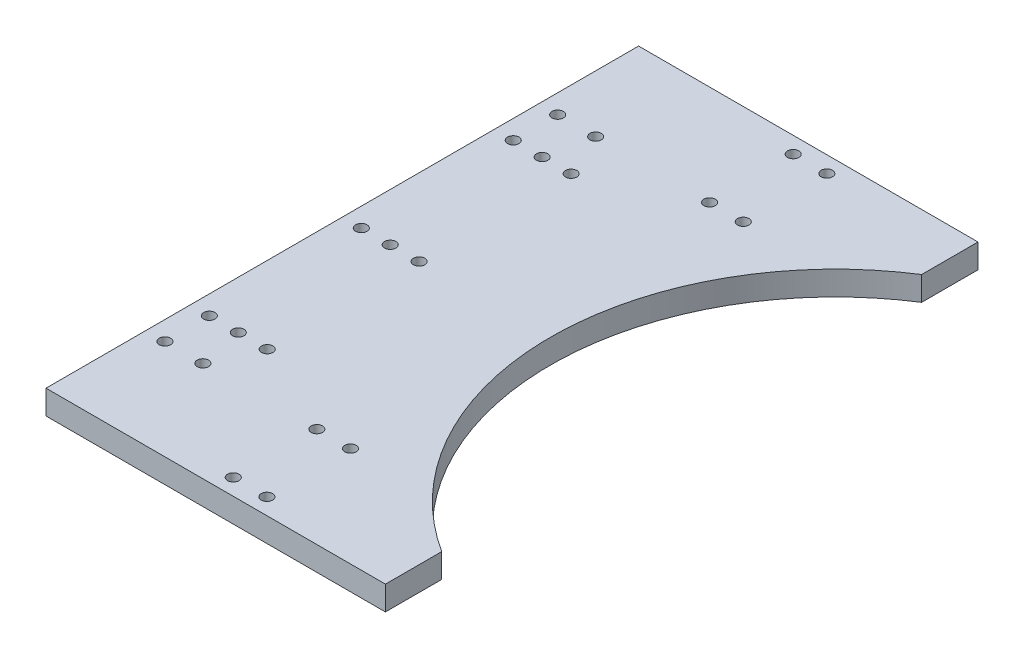
ISO-10303-21;
HEADER;
FILE_DESCRIPTION(('STEP AP214'),'2;1');
FILE_NAME('part.step','',(''),(''),'','','');
FILE_SCHEMA(('AUTOMOTIVE_DESIGN { 1 0 10303 214 1 1 1 1 }'));
ENDSEC;
DATA;
#1=APPLICATION_CONTEXT('core data for automotive mechanical design processes');
#2=APPLICATION_PROTOCOL_DEFINITION('international standard','automotive_design',2000,#1);
#3=PRODUCT_CONTEXT('',#1,'mechanical');
#4=PRODUCT('Part','Part','',(#3));
#5=PRODUCT_RELATED_PRODUCT_CATEGORY('part','',(#4));
#6=PRODUCT_DEFINITION_FORMATION('','',#4);
#7=PRODUCT_DEFINITION_CONTEXT('part definition',#1,'design');
#8=PRODUCT_DEFINITION('design','',#6,#7);
#9=PRODUCT_DEFINITION_SHAPE('','',#8);
#10=(LENGTH_UNIT() NAMED_UNIT(*) SI_UNIT(.MILLI.,.METRE.));
#11=(NAMED_UNIT(*) PLANE_ANGLE_UNIT() SI_UNIT($,.RADIAN.));
#12=(NAMED_UNIT(*) SI_UNIT($,.STERADIAN.) SOLID_ANGLE_UNIT());
#13=UNCERTAINTY_MEASURE_WITH_UNIT(LENGTH_MEASURE(1.E-05),#10,'distance_accuracy_value','');
#14=(GEOMETRIC_REPRESENTATION_CONTEXT(3) GLOBAL_UNCERTAINTY_ASSIGNED_CONTEXT((#13)) GLOBAL_UNIT_ASSIGNED_CONTEXT((#10,
#11,#12)) REPRESENTATION_CONTEXT('',''));
#15=CARTESIAN_POINT('',(0.,0.,0.));
#16=DIRECTION('',(0.,0.,1.));
#17=DIRECTION('',(1.,0.,0.));
#18=AXIS2_PLACEMENT_3D('',#15,#16,#17);
#19=CARTESIAN_POINT('',(129.779581991408,6.35,-78.));
#20=DIRECTION('',(0.,1.,0.));
#21=DIRECTION('',(0.,0.,1.));
#22=AXIS2_PLACEMENT_3D('',#19,#20,#21);
#23=PLANE('',#22);
#24=CARTESIAN_POINT('',(20.24,6.35,-78.));
#25=DIRECTION('',(0.,1.,0.));
#26=DIRECTION('',(0.,0.,1.));
#27=AXIS2_PLACEMENT_3D('',#24,#25,#26);
#28=CIRCLE('',#27,1.5);
#29=CARTESIAN_POINT('',(20.24,6.35,-76.5));
#30=VERTEX_POINT('',#29);
#31=EDGE_CURVE('E324',#30,#30,#28,.T.);
#32=ORIENTED_EDGE('',*,*,#31,.F.);
#33=EDGE_LOOP('',(#32));
#34=FACE_BOUND('',#33,.T.);
#35=CARTESIAN_POINT('',(12.62,6.35,-38.));
#36=DIRECTION('',(0.,1.,0.));
#37=DIRECTION('',(0.,0.,-1.));
#38=AXIS2_PLACEMENT_3D('',#35,#36,#37);
#39=CIRCLE('',#38,1.5);
#40=CARTESIAN_POINT('',(12.62,6.35,-39.5));
#41=VERTEX_POINT('',#40);
#42=EDGE_CURVE('E308',#41,#41,#39,.T.);
#43=ORIENTED_EDGE('',*,*,#42,.F.);
#44=EDGE_LOOP('',(#43));
#45=FACE_BOUND('',#44,.T.);
#46=CARTESIAN_POINT('',(12.62,6.35,-118.));
#47=DIRECTION('',(0.,1.,0.));
#48=DIRECTION('',(0.,0.,1.));
#49=AXIS2_PLACEMENT_3D('',#46,#47,#48);
#50=CIRCLE('',#49,1.5);
#51=CARTESIAN_POINT('',(12.62,6.35,-116.5));
#52=VERTEX_POINT('',#51);
#53=EDGE_CURVE('E292',#52,#52,#50,.T.);
#54=ORIENTED_EDGE('',*,*,#53,.F.);
#55=EDGE_LOOP('',(#54));
#56=FACE_BOUND('',#55,.T.);
#57=CARTESIAN_POINT('',(5.,6.35,-78.));
#58=DIRECTION('',(0.,1.,0.));
#59=DIRECTION('',(0.,0.,1.));
#60=AXIS2_PLACEMENT_3D('',#57,#58,#59);
#61=CIRCLE('',#60,1.5);
#62=CARTESIAN_POINT('',(5.,6.35,-76.5));
#63=VERTEX_POINT('',#62);
#64=EDGE_CURVE('E276',#63,#63,#61,.T.);
#65=ORIENTED_EDGE('',*,*,#64,.F.);
#66=EDGE_LOOP('',(#65));
#67=FACE_BOUND('',#66,.T.);
#68=CARTESIAN_POINT('',(45.,6.35,-151.7));
#69=DIRECTION('',(0.,1.,0.));
#70=DIRECTION('',(0.,0.,-1.));
#71=AXIS2_PLACEMENT_3D('',#68,#69,#70);
#72=CIRCLE('',#71,1.5);
#73=CARTESIAN_POINT('',(45.,6.35,-153.2));
#74=VERTEX_POINT('',#73);
#75=EDGE_CURVE('E260',#74,#74,#72,.T.);
#76=ORIENTED_EDGE('',*,*,#75,.F.);
#77=EDGE_LOOP('',(#76));
#78=FACE_BOUND('',#77,.T.);
#79=CARTESIAN_POINT('',(5.,6.35,-129.7));
#80=DIRECTION('',(0.,1.,0.));
#81=DIRECTION('',(0.,0.,-1.));
#82=AXIS2_PLACEMENT_3D('',#79,#80,#81);
#83=CIRCLE('',#82,1.5);
#84=CARTESIAN_POINT('',(5.,6.35,-131.2));
#85=VERTEX_POINT('',#84);
#86=EDGE_CURVE('E244',#85,#85,#83,.T.);
#87=ORIENTED_EDGE('',*,*,#86,.F.);
#88=EDGE_LOOP('',(#87));
#89=FACE_BOUND('',#88,.T.);
#90=CARTESIAN_POINT('',(53.85,6.35,-151.7));
#91=DIRECTION('',(0.,1.,0.));
#92=DIRECTION('',(0.,0.,-1.));
#93=AXIS2_PLACEMENT_3D('',#90,#91,#92);
#94=CIRCLE('',#93,1.5);
#95=CARTESIAN_POINT('',(53.85,6.35,-153.2));
#96=VERTEX_POINT('',#95);
#97=EDGE_CURVE('E228',#96,#96,#94,.T.);
#98=ORIENTED_EDGE('',*,*,#97,.F.);
#99=EDGE_LOOP('',(#98));
#100=FACE_BOUND('',#99,.T.);
#101=CARTESIAN_POINT('',(53.85,6.35,-26.3));
#102=DIRECTION('',(0.,1.,0.));
#103=DIRECTION('',(0.,0.,1.));
#104=AXIS2_PLACEMENT_3D('',#101,#102,#103);
#105=CIRCLE('',#104,1.5);
#106=CARTESIAN_POINT('',(53.85,6.35,-24.8));
#107=VERTEX_POINT('',#106);
#108=EDGE_CURVE('E212',#107,#107,#105,.T.);
#109=ORIENTED_EDGE('',*,*,#108,.F.);
#110=EDGE_LOOP('',(#109));
#111=FACE_BOUND('',#110,.T.);
#112=CARTESIAN_POINT('',(5.,6.35,-26.3));
#113=DIRECTION('',(0.,1.,0.));
#114=DIRECTION('',(0.,0.,1.));
#115=AXIS2_PLACEMENT_3D('',#112,#113,#114);
#116=CIRCLE('',#115,1.5);
#117=CARTESIAN_POINT('',(5.,6.35,-24.8));
#118=VERTEX_POINT('',#117);
#119=EDGE_CURVE('E196',#118,#118,#116,.T.);
#120=ORIENTED_EDGE('',*,*,#119,.F.);
#121=EDGE_LOOP('',(#120));
#122=FACE_BOUND('',#121,.T.);
#123=CARTESIAN_POINT('',(45.,6.35,-4.29999999999999));
#124=DIRECTION('',(0.,1.,0.));
#125=DIRECTION('',(0.,0.,1.));
#126=AXIS2_PLACEMENT_3D('',#123,#124,#125);
#127=CIRCLE('',#126,1.5);
#128=CARTESIAN_POINT('',(45.,6.35,-2.79999999999999));
#129=VERTEX_POINT('',#128);
#130=EDGE_CURVE('E180',#129,#129,#127,.T.);
#131=ORIENTED_EDGE('',*,*,#130,.F.);
#132=EDGE_LOOP('',(#131));
#133=FACE_BOUND('',#132,.T.);
#134=DIRECTION('',(0.,0.,1.));
#135=VECTOR('',#134,1.);
#136=CARTESIAN_POINT('',(0.,6.35,0.));
#137=LINE('',#136,#135);
#138=CARTESIAN_POINT('',(0.,6.35,-156.));
#139=VERTEX_POINT('',#138);
#140=CARTESIAN_POINT('',(0.,6.35,0.));
#141=VERTEX_POINT('',#140);
#142=EDGE_CURVE('E150',#139,#141,#137,.T.);
#143=ORIENTED_EDGE('',*,*,#142,.T.);
#144=DIRECTION('',(1.,0.,0.));
#145=VECTOR('',#144,1.);
#146=CARTESIAN_POINT('',(0.,6.35,0.));
#147=LINE('',#146,#145);
#148=CARTESIAN_POINT('',(89.35,6.35,0.));
#149=VERTEX_POINT('',#148);
#150=EDGE_CURVE('E95',#141,#149,#147,.T.);
#151=ORIENTED_EDGE('',*,*,#150,.T.);
#152=DIRECTION('',(0.,0.,-1.));
#153=VECTOR('',#152,1.);
#154=CARTESIAN_POINT('',(89.35,6.35,-14.83));
#155=LINE('',#154,#153);
#156=CARTESIAN_POINT('',(89.35,6.35,-14.83));
#157=VERTEX_POINT('',#156);
#158=EDGE_CURVE('E109',#149,#157,#155,.T.);
#159=ORIENTED_EDGE('',*,*,#158,.T.);
#160=CARTESIAN_POINT('',(129.779581991408,6.35,-78.));
#161=DIRECTION('',(0.,-1.,0.));
#162=DIRECTION('',(0.,0.,1.));
#163=AXIS2_PLACEMENT_3D('',#160,#161,#162);
#164=CIRCLE('',#163,75.);
#165=CARTESIAN_POINT('',(89.35,6.35,-141.17));
#166=VERTEX_POINT('',#165);
#167=EDGE_CURVE('E102',#157,#166,#164,.T.);
#168=ORIENTED_EDGE('',*,*,#167,.T.);
#169=DIRECTION('',(0.,0.,-1.));
#170=VECTOR('',#169,1.);
#171=CARTESIAN_POINT('',(89.35,6.35,-156.));
#172=LINE('',#171,#170);
#173=CARTESIAN_POINT('',(89.35,6.35,-156.));
#174=VERTEX_POINT('',#173);
#175=EDGE_CURVE('E106',#166,#174,#172,.T.);
#176=ORIENTED_EDGE('',*,*,#175,.T.);
#177=DIRECTION('',(-1.,0.,0.));
#178=VECTOR('',#177,1.);
#179=CARTESIAN_POINT('',(57.85,6.35,-156.));
#180=LINE('',#179,#178);
#181=EDGE_CURVE('E61',#174,#139,#180,.T.);
#182=ORIENTED_EDGE('',*,*,#181,.T.);
#183=EDGE_LOOP('',(#143,#151,#159,#168,#176,#182));
#184=FACE_BOUND('',#183,.T.);
#185=CARTESIAN_POINT('',(45.,6.35,-26.3));
#186=DIRECTION('',(0.,1.,0.));
#187=DIRECTION('',(0.,0.,1.));
#188=AXIS2_PLACEMENT_3D('',#185,#186,#187);
#189=CIRCLE('',#188,1.5);
#190=CARTESIAN_POINT('',(45.,6.35,-24.8));
#191=VERTEX_POINT('',#190);
#192=EDGE_CURVE('E138',#191,#191,#189,.T.);
#193=ORIENTED_EDGE('',*,*,#192,.F.);
#194=EDGE_LOOP('',(#193));
#195=FACE_BOUND('',#194,.T.);
#196=CARTESIAN_POINT('',(15.,6.35,-26.3));
#197=DIRECTION('',(0.,1.,0.));
#198=DIRECTION('',(0.,0.,1.));
#199=AXIS2_PLACEMENT_3D('',#196,#197,#198);
#200=CIRCLE('',#199,1.5);
#201=CARTESIAN_POINT('',(15.,6.35,-24.8));
#202=VERTEX_POINT('',#201);
#203=EDGE_CURVE('E188',#202,#202,#200,.T.);
#204=ORIENTED_EDGE('',*,*,#203,.F.);
#205=EDGE_LOOP('',(#204));
#206=FACE_BOUND('',#205,.T.);
#207=CARTESIAN_POINT('',(5.,6.35,-118.));
#208=DIRECTION('',(0.,1.,0.));
#209=DIRECTION('',(0.,0.,1.));
#210=AXIS2_PLACEMENT_3D('',#207,#208,#209);
#211=CIRCLE('',#210,1.5);
#212=CARTESIAN_POINT('',(5.,6.35,-116.5));
#213=VERTEX_POINT('',#212);
#214=EDGE_CURVE('E204',#213,#213,#211,.T.);
#215=ORIENTED_EDGE('',*,*,#214,.F.);
#216=EDGE_LOOP('',(#215));
#217=FACE_BOUND('',#216,.T.);
#218=CARTESIAN_POINT('',(53.85,6.35,-4.3));
#219=DIRECTION('',(0.,1.,0.));
#220=DIRECTION('',(0.,0.,1.));
#221=AXIS2_PLACEMENT_3D('',#218,#219,#220);
#222=CIRCLE('',#221,1.5);
#223=CARTESIAN_POINT('',(53.85,6.35,-2.79999999999999));
#224=VERTEX_POINT('',#223);
#225=EDGE_CURVE('E220',#224,#224,#222,.T.);
#226=ORIENTED_EDGE('',*,*,#225,.F.);
#227=EDGE_LOOP('',(#226));
#228=FACE_BOUND('',#227,.T.);
#229=CARTESIAN_POINT('',(53.85,6.35,-129.7));
#230=DIRECTION('',(0.,1.,0.));
#231=DIRECTION('',(0.,0.,-1.));
#232=AXIS2_PLACEMENT_3D('',#229,#230,#231);
#233=CIRCLE('',#232,1.5);
#234=CARTESIAN_POINT('',(53.85,6.35,-131.2));
#235=VERTEX_POINT('',#234);
#236=EDGE_CURVE('E236',#235,#235,#233,.T.);
#237=ORIENTED_EDGE('',*,*,#236,.F.);
#238=EDGE_LOOP('',(#237));
#239=FACE_BOUND('',#238,.T.);
#240=CARTESIAN_POINT('',(15.,6.35,-129.7));
#241=DIRECTION('',(0.,1.,0.));
#242=DIRECTION('',(0.,0.,-1.));
#243=AXIS2_PLACEMENT_3D('',#240,#241,#242);
#244=CIRCLE('',#243,1.5);
#245=CARTESIAN_POINT('',(15.,6.35,-131.2));
#246=VERTEX_POINT('',#245);
#247=EDGE_CURVE('E252',#246,#246,#244,.T.);
#248=ORIENTED_EDGE('',*,*,#247,.F.);
#249=EDGE_LOOP('',(#248));
#250=FACE_BOUND('',#249,.T.);
#251=CARTESIAN_POINT('',(45.,6.35,-129.7));
#252=DIRECTION('',(0.,1.,0.));
#253=DIRECTION('',(0.,0.,-1.));
#254=AXIS2_PLACEMENT_3D('',#251,#252,#253);
#255=CIRCLE('',#254,1.5);
#256=CARTESIAN_POINT('',(45.,6.35,-131.2));
#257=VERTEX_POINT('',#256);
#258=EDGE_CURVE('E268',#257,#257,#255,.T.);
#259=ORIENTED_EDGE('',*,*,#258,.F.);
#260=EDGE_LOOP('',(#259));
#261=FACE_BOUND('',#260,.T.);
#262=CARTESIAN_POINT('',(5.,6.35,-38.));
#263=DIRECTION('',(0.,1.,0.));
#264=DIRECTION('',(0.,0.,-1.));
#265=AXIS2_PLACEMENT_3D('',#262,#263,#264);
#266=CIRCLE('',#265,1.5);
#267=CARTESIAN_POINT('',(5.,6.35,-39.5));
#268=VERTEX_POINT('',#267);
#269=EDGE_CURVE('E284',#268,#268,#266,.T.);
#270=ORIENTED_EDGE('',*,*,#269,.F.);
#271=EDGE_LOOP('',(#270));
#272=FACE_BOUND('',#271,.T.);
#273=CARTESIAN_POINT('',(12.62,6.35,-78.));
#274=DIRECTION('',(0.,1.,0.));
#275=DIRECTION('',(0.,0.,1.));
#276=AXIS2_PLACEMENT_3D('',#273,#274,#275);
#277=CIRCLE('',#276,1.5);
#278=CARTESIAN_POINT('',(12.62,6.35,-76.5));
#279=VERTEX_POINT('',#278);
#280=EDGE_CURVE('E300',#279,#279,#277,.T.);
#281=ORIENTED_EDGE('',*,*,#280,.F.);
#282=EDGE_LOOP('',(#281));
#283=FACE_BOUND('',#282,.T.);
#284=CARTESIAN_POINT('',(20.24,6.35,-118.));
#285=DIRECTION('',(0.,1.,0.));
#286=DIRECTION('',(0.,0.,1.));
#287=AXIS2_PLACEMENT_3D('',#284,#285,#286);
#288=CIRCLE('',#287,1.5);
#289=CARTESIAN_POINT('',(20.24,6.35,-116.5));
#290=VERTEX_POINT('',#289);
#291=EDGE_CURVE('E316',#290,#290,#288,.T.);
#292=ORIENTED_EDGE('',*,*,#291,.F.);
#293=EDGE_LOOP('',(#292));
#294=FACE_BOUND('',#293,.T.);
#295=CARTESIAN_POINT('',(20.24,6.35,-38.));
#296=DIRECTION('',(0.,1.,0.));
#297=DIRECTION('',(0.,0.,-1.));
#298=AXIS2_PLACEMENT_3D('',#295,#296,#297);
#299=CIRCLE('',#298,1.5);
#300=CARTESIAN_POINT('',(20.24,6.35,-39.5));
#301=VERTEX_POINT('',#300);
#302=EDGE_CURVE('E332',#301,#301,#299,.T.);
#303=ORIENTED_EDGE('',*,*,#302,.F.);
#304=EDGE_LOOP('',(#303));
#305=FACE_BOUND('',#304,.T.);
#306=ADVANCED_FACE('F43',(#34,#45,#56,#67,#78,#89,#100,#111,#122,#133,#184,#195,#206,#217,#228,
#239,#250,#261,#272,#283,#294,#305),#23,.T.);
#307=CARTESIAN_POINT('',(129.779581991408,0.,-78.));
#308=DIRECTION('',(0.,1.,0.));
#309=DIRECTION('',(0.,0.,1.));
#310=AXIS2_PLACEMENT_3D('',#307,#308,#309);
#311=PLANE('',#310);
#312=DIRECTION('',(1.,0.,0.));
#313=VECTOR('',#312,1.);
#314=CARTESIAN_POINT('',(57.85,0.,0.));
#315=LINE('',#314,#313);
#316=CARTESIAN_POINT('',(0.,0.,0.));
#317=VERTEX_POINT('',#316);
#318=CARTESIAN_POINT('',(89.35,0.,0.));
#319=VERTEX_POINT('',#318);
#320=EDGE_CURVE('E134',#317,#319,#315,.T.);
#321=ORIENTED_EDGE('',*,*,#320,.F.);
#322=DIRECTION('',(0.,0.,1.));
#323=VECTOR('',#322,1.);
#324=CARTESIAN_POINT('',(0.,0.,-124.7));
#325=LINE('',#324,#323);
#326=CARTESIAN_POINT('',(0.,0.,-156.));
#327=VERTEX_POINT('',#326);
#328=EDGE_CURVE('E88',#327,#317,#325,.T.);
#329=ORIENTED_EDGE('',*,*,#328,.F.);
#330=DIRECTION('',(-1.,0.,0.));
#331=VECTOR('',#330,1.);
#332=CARTESIAN_POINT('',(0.,0.,-156.));
#333=LINE('',#332,#331);
#334=CARTESIAN_POINT('',(89.35,0.,-156.));
#335=VERTEX_POINT('',#334);
#336=EDGE_CURVE('E84',#335,#327,#333,.T.);
#337=ORIENTED_EDGE('',*,*,#336,.F.);
#338=DIRECTION('',(0.,0.,-1.));
#339=VECTOR('',#338,1.);
#340=CARTESIAN_POINT('',(89.35,0.,-156.));
#341=LINE('',#340,#339);
#342=CARTESIAN_POINT('',(89.35,0.,-141.17));
#343=VERTEX_POINT('',#342);
#344=EDGE_CURVE('E143',#343,#335,#341,.T.);
#345=ORIENTED_EDGE('',*,*,#344,.F.);
#346=CARTESIAN_POINT('',(129.779581991408,0.,-78.));
#347=DIRECTION('',(0.,-1.,0.));
#348=DIRECTION('',(0.,0.,1.));
#349=AXIS2_PLACEMENT_3D('',#346,#347,#348);
#350=CIRCLE('',#349,75.);
#351=CARTESIAN_POINT('',(89.35,0.,-14.83));
#352=VERTEX_POINT('',#351);
#353=EDGE_CURVE('E119',#352,#343,#350,.T.);
#354=ORIENTED_EDGE('',*,*,#353,.F.);
#355=DIRECTION('',(0.,0.,-1.));
#356=VECTOR('',#355,1.);
#357=CARTESIAN_POINT('',(89.35,0.,-14.83));
#358=LINE('',#357,#356);
#359=EDGE_CURVE('E137',#319,#352,#358,.T.);
#360=ORIENTED_EDGE('',*,*,#359,.F.);
#361=EDGE_LOOP('',(#321,#329,#337,#345,#354,#360));
#362=FACE_BOUND('',#361,.T.);
#363=CARTESIAN_POINT('',(45.,0.,-26.3));
#364=DIRECTION('',(0.,1.,0.));
#365=DIRECTION('',(0.,0.,1.));
#366=AXIS2_PLACEMENT_3D('',#363,#364,#365);
#367=CIRCLE('',#366,1.5);
#368=CARTESIAN_POINT('',(45.,0.,-24.8));
#369=VERTEX_POINT('',#368);
#370=EDGE_CURVE('E175',#369,#369,#367,.T.);
#371=ORIENTED_EDGE('',*,*,#370,.T.);
#372=EDGE_LOOP('',(#371));
#373=FACE_BOUND('',#372,.T.);
#374=CARTESIAN_POINT('',(45.,0.,-4.29999999999999));
#375=DIRECTION('',(0.,1.,0.));
#376=DIRECTION('',(0.,0.,1.));
#377=AXIS2_PLACEMENT_3D('',#374,#375,#376);
#378=CIRCLE('',#377,1.5);
#379=CARTESIAN_POINT('',(45.,0.,-2.79999999999999));
#380=VERTEX_POINT('',#379);
#381=EDGE_CURVE('E184',#380,#380,#378,.T.);
#382=ORIENTED_EDGE('',*,*,#381,.T.);
#383=EDGE_LOOP('',(#382));
#384=FACE_BOUND('',#383,.T.);
#385=CARTESIAN_POINT('',(15.,0.,-26.3));
#386=DIRECTION('',(0.,1.,0.));
#387=DIRECTION('',(0.,0.,1.));
#388=AXIS2_PLACEMENT_3D('',#385,#386,#387);
#389=CIRCLE('',#388,1.5);
#390=CARTESIAN_POINT('',(15.,0.,-24.8));
#391=VERTEX_POINT('',#390);
#392=EDGE_CURVE('E192',#391,#391,#389,.T.);
#393=ORIENTED_EDGE('',*,*,#392,.T.);
#394=EDGE_LOOP('',(#393));
#395=FACE_BOUND('',#394,.T.);
#396=CARTESIAN_POINT('',(5.,0.,-26.3));
#397=DIRECTION('',(0.,1.,0.));
#398=DIRECTION('',(0.,0.,1.));
#399=AXIS2_PLACEMENT_3D('',#396,#397,#398);
#400=CIRCLE('',#399,1.5);
#401=CARTESIAN_POINT('',(5.,0.,-24.8));
#402=VERTEX_POINT('',#401);
#403=EDGE_CURVE('E200',#402,#402,#400,.T.);
#404=ORIENTED_EDGE('',*,*,#403,.T.);
#405=EDGE_LOOP('',(#404));
#406=FACE_BOUND('',#405,.T.);
#407=CARTESIAN_POINT('',(5.,0.,-118.));
#408=DIRECTION('',(0.,1.,0.));
#409=DIRECTION('',(0.,0.,1.));
#410=AXIS2_PLACEMENT_3D('',#407,#408,#409);
#411=CIRCLE('',#410,1.5);
#412=CARTESIAN_POINT('',(5.,0.,-116.5));
#413=VERTEX_POINT('',#412);
#414=EDGE_CURVE('E208',#413,#413,#411,.T.);
#415=ORIENTED_EDGE('',*,*,#414,.T.);
#416=EDGE_LOOP('',(#415));
#417=FACE_BOUND('',#416,.T.);
#418=CARTESIAN_POINT('',(53.85,0.,-26.3));
#419=DIRECTION('',(0.,1.,0.));
#420=DIRECTION('',(0.,0.,1.));
#421=AXIS2_PLACEMENT_3D('',#418,#419,#420);
#422=CIRCLE('',#421,1.5);
#423=CARTESIAN_POINT('',(53.85,0.,-24.8));
#424=VERTEX_POINT('',#423);
#425=EDGE_CURVE('E216',#424,#424,#422,.T.);
#426=ORIENTED_EDGE('',*,*,#425,.T.);
#427=EDGE_LOOP('',(#426));
#428=FACE_BOUND('',#427,.T.);
#429=CARTESIAN_POINT('',(53.85,0.,-4.3));
#430=DIRECTION('',(0.,1.,0.));
#431=DIRECTION('',(0.,0.,1.));
#432=AXIS2_PLACEMENT_3D('',#429,#430,#431);
#433=CIRCLE('',#432,1.5);
#434=CARTESIAN_POINT('',(53.85,0.,-2.79999999999999));
#435=VERTEX_POINT('',#434);
#436=EDGE_CURVE('E224',#435,#435,#433,.T.);
#437=ORIENTED_EDGE('',*,*,#436,.T.);
#438=EDGE_LOOP('',(#437));
#439=FACE_BOUND('',#438,.T.);
#440=CARTESIAN_POINT('',(53.85,0.,-151.7));
#441=DIRECTION('',(0.,1.,0.));
#442=DIRECTION('',(0.,0.,-1.));
#443=AXIS2_PLACEMENT_3D('',#440,#441,#442);
#444=CIRCLE('',#443,1.5);
#445=CARTESIAN_POINT('',(53.85,0.,-153.2));
#446=VERTEX_POINT('',#445);
#447=EDGE_CURVE('E232',#446,#446,#444,.T.);
#448=ORIENTED_EDGE('',*,*,#447,.T.);
#449=EDGE_LOOP('',(#448));
#450=FACE_BOUND('',#449,.T.);
#451=CARTESIAN_POINT('',(53.85,0.,-129.7));
#452=DIRECTION('',(0.,1.,0.));
#453=DIRECTION('',(0.,0.,-1.));
#454=AXIS2_PLACEMENT_3D('',#451,#452,#453);
#455=CIRCLE('',#454,1.5);
#456=CARTESIAN_POINT('',(53.85,0.,-131.2));
#457=VERTEX_POINT('',#456);
#458=EDGE_CURVE('E240',#457,#457,#455,.T.);
#459=ORIENTED_EDGE('',*,*,#458,.T.);
#460=EDGE_LOOP('',(#459));
#461=FACE_BOUND('',#460,.T.);
#462=CARTESIAN_POINT('',(5.,0.,-129.7));
#463=DIRECTION('',(0.,1.,0.));
#464=DIRECTION('',(0.,0.,-1.));
#465=AXIS2_PLACEMENT_3D('',#462,#463,#464);
#466=CIRCLE('',#465,1.5);
#467=CARTESIAN_POINT('',(5.,0.,-131.2));
#468=VERTEX_POINT('',#467);
#469=EDGE_CURVE('E248',#468,#468,#466,.T.);
#470=ORIENTED_EDGE('',*,*,#469,.T.);
#471=EDGE_LOOP('',(#470));
#472=FACE_BOUND('',#471,.T.);
#473=CARTESIAN_POINT('',(15.,0.,-129.7));
#474=DIRECTION('',(0.,1.,0.));
#475=DIRECTION('',(0.,0.,-1.));
#476=AXIS2_PLACEMENT_3D('',#473,#474,#475);
#477=CIRCLE('',#476,1.5);
#478=CARTESIAN_POINT('',(15.,0.,-131.2));
#479=VERTEX_POINT('',#478);
#480=EDGE_CURVE('E256',#479,#479,#477,.T.);
#481=ORIENTED_EDGE('',*,*,#480,.T.);
#482=EDGE_LOOP('',(#481));
#483=FACE_BOUND('',#482,.T.);
#484=CARTESIAN_POINT('',(45.,0.,-151.7));
#485=DIRECTION('',(0.,1.,0.));
#486=DIRECTION('',(0.,0.,-1.));
#487=AXIS2_PLACEMENT_3D('',#484,#485,#486);
#488=CIRCLE('',#487,1.5);
#489=CARTESIAN_POINT('',(45.,0.,-153.2));
#490=VERTEX_POINT('',#489);
#491=EDGE_CURVE('E264',#490,#490,#488,.T.);
#492=ORIENTED_EDGE('',*,*,#491,.T.);
#493=EDGE_LOOP('',(#492));
#494=FACE_BOUND('',#493,.T.);
#495=CARTESIAN_POINT('',(45.,0.,-129.7));
#496=DIRECTION('',(0.,1.,0.));
#497=DIRECTION('',(0.,0.,-1.));
#498=AXIS2_PLACEMENT_3D('',#495,#496,#497);
#499=CIRCLE('',#498,1.5);
#500=CARTESIAN_POINT('',(45.,0.,-131.2));
#501=VERTEX_POINT('',#500);
#502=EDGE_CURVE('E272',#501,#501,#499,.T.);
#503=ORIENTED_EDGE('',*,*,#502,.T.);
#504=EDGE_LOOP('',(#503));
#505=FACE_BOUND('',#504,.T.);
#506=CARTESIAN_POINT('',(5.,0.,-78.));
#507=DIRECTION('',(0.,1.,0.));
#508=DIRECTION('',(0.,0.,1.));
#509=AXIS2_PLACEMENT_3D('',#506,#507,#508);
#510=CIRCLE('',#509,1.5);
#511=CARTESIAN_POINT('',(5.,0.,-76.5));
#512=VERTEX_POINT('',#511);
#513=EDGE_CURVE('E280',#512,#512,#510,.T.);
#514=ORIENTED_EDGE('',*,*,#513,.T.);
#515=EDGE_LOOP('',(#514));
#516=FACE_BOUND('',#515,.T.);
#517=CARTESIAN_POINT('',(5.,0.,-38.));
#518=DIRECTION('',(0.,1.,0.));
#519=DIRECTION('',(0.,0.,-1.));
#520=AXIS2_PLACEMENT_3D('',#517,#518,#519);
#521=CIRCLE('',#520,1.5);
#522=CARTESIAN_POINT('',(5.,0.,-39.5));
#523=VERTEX_POINT('',#522);
#524=EDGE_CURVE('E288',#523,#523,#521,.T.);
#525=ORIENTED_EDGE('',*,*,#524,.T.);
#526=EDGE_LOOP('',(#525));
#527=FACE_BOUND('',#526,.T.);
#528=CARTESIAN_POINT('',(12.62,0.,-118.));
#529=DIRECTION('',(0.,1.,0.));
#530=DIRECTION('',(0.,0.,1.));
#531=AXIS2_PLACEMENT_3D('',#528,#529,#530);
#532=CIRCLE('',#531,1.5);
#533=CARTESIAN_POINT('',(12.62,0.,-116.5));
#534=VERTEX_POINT('',#533);
#535=EDGE_CURVE('E296',#534,#534,#532,.T.);
#536=ORIENTED_EDGE('',*,*,#535,.T.);
#537=EDGE_LOOP('',(#536));
#538=FACE_BOUND('',#537,.T.);
#539=CARTESIAN_POINT('',(12.62,0.,-78.));
#540=DIRECTION('',(0.,1.,0.));
#541=DIRECTION('',(0.,0.,1.));
#542=AXIS2_PLACEMENT_3D('',#539,#540,#541);
#543=CIRCLE('',#542,1.5);
#544=CARTESIAN_POINT('',(12.62,0.,-76.5));
#545=VERTEX_POINT('',#544);
#546=EDGE_CURVE('E304',#545,#545,#543,.T.);
#547=ORIENTED_EDGE('',*,*,#546,.T.);
#548=EDGE_LOOP('',(#547));
#549=FACE_BOUND('',#548,.T.);
#550=CARTESIAN_POINT('',(12.62,0.,-38.));
#551=DIRECTION('',(0.,1.,0.));
#552=DIRECTION('',(0.,0.,-1.));
#553=AXIS2_PLACEMENT_3D('',#550,#551,#552);
#554=CIRCLE('',#553,1.5);
#555=CARTESIAN_POINT('',(12.62,0.,-39.5));
#556=VERTEX_POINT('',#555);
#557=EDGE_CURVE('E312',#556,#556,#554,.T.);
#558=ORIENTED_EDGE('',*,*,#557,.T.);
#559=EDGE_LOOP('',(#558));
#560=FACE_BOUND('',#559,.T.);
#561=CARTESIAN_POINT('',(20.24,0.,-118.));
#562=DIRECTION('',(0.,1.,0.));
#563=DIRECTION('',(0.,0.,1.));
#564=AXIS2_PLACEMENT_3D('',#561,#562,#563);
#565=CIRCLE('',#564,1.5);
#566=CARTESIAN_POINT('',(20.24,0.,-116.5));
#567=VERTEX_POINT('',#566);
#568=EDGE_CURVE('E320',#567,#567,#565,.T.);
#569=ORIENTED_EDGE('',*,*,#568,.T.);
#570=EDGE_LOOP('',(#569));
#571=FACE_BOUND('',#570,.T.);
#572=CARTESIAN_POINT('',(20.24,0.,-78.));
#573=DIRECTION('',(0.,1.,0.));
#574=DIRECTION('',(0.,0.,1.));
#575=AXIS2_PLACEMENT_3D('',#572,#573,#574);
#576=CIRCLE('',#575,1.5);
#577=CARTESIAN_POINT('',(20.24,0.,-76.5));
#578=VERTEX_POINT('',#577);
#579=EDGE_CURVE('E328',#578,#578,#576,.T.);
#580=ORIENTED_EDGE('',*,*,#579,.T.);
#581=EDGE_LOOP('',(#580));
#582=FACE_BOUND('',#581,.T.);
#583=CARTESIAN_POINT('',(20.24,0.,-38.));
#584=DIRECTION('',(0.,1.,0.));
#585=DIRECTION('',(0.,0.,-1.));
#586=AXIS2_PLACEMENT_3D('',#583,#584,#585);
#587=CIRCLE('',#586,1.5);
#588=CARTESIAN_POINT('',(20.24,0.,-39.5));
#589=VERTEX_POINT('',#588);
#590=EDGE_CURVE('E336',#589,#589,#587,.T.);
#591=ORIENTED_EDGE('',*,*,#590,.T.);
#592=EDGE_LOOP('',(#591));
#593=FACE_BOUND('',#592,.T.);
#594=ADVANCED_FACE('F162',(#362,#373,#384,#395,#406,#417,#428,#439,#450,#461,#472,#483,#494,
#505,#516,#527,#538,#549,#560,#571,#582,#593),#311,.F.);
#595=CARTESIAN_POINT('',(57.85,6.35,0.));
#596=DIRECTION('',(0.,0.,-1.));
#597=DIRECTION('',(-1.,0.,0.));
#598=AXIS2_PLACEMENT_3D('',#595,#596,#597);
#599=PLANE('',#598);
#600=ORIENTED_EDGE('',*,*,#320,.T.);
#601=DIRECTION('',(0.,-1.,0.));
#602=VECTOR('',#601,1.);
#603=CARTESIAN_POINT('',(89.35,6.35,0.));
#604=LINE('',#603,#602);
#605=EDGE_CURVE('E53',#149,#319,#604,.T.);
#606=ORIENTED_EDGE('',*,*,#605,.F.);
#607=ORIENTED_EDGE('',*,*,#150,.F.);
#608=DIRECTION('',(0.,-1.,0.));
#609=VECTOR('',#608,1.);
#610=CARTESIAN_POINT('',(0.,6.35,0.));
#611=LINE('',#610,#609);
#612=EDGE_CURVE('E11',#141,#317,#611,.T.);
#613=ORIENTED_EDGE('',*,*,#612,.T.);
#614=EDGE_LOOP('',(#600,#606,#607,#613));
#615=FACE_BOUND('',#614,.T.);
#616=ADVANCED_FACE('F45',(#615),#599,.F.);
#617=CARTESIAN_POINT('',(89.35,6.35,-14.83));
#618=DIRECTION('',(-1.,0.,0.));
#619=DIRECTION('',(0.,0.,1.));
#620=AXIS2_PLACEMENT_3D('',#617,#618,#619);
#621=PLANE('',#620);
#622=ORIENTED_EDGE('',*,*,#359,.T.);
#623=DIRECTION('',(0.,-1.,0.));
#624=VECTOR('',#623,1.);
#625=CARTESIAN_POINT('',(89.35,6.35,-14.83));
#626=LINE('',#625,#624);
#627=EDGE_CURVE('E122',#157,#352,#626,.T.);
#628=ORIENTED_EDGE('',*,*,#627,.F.);
#629=ORIENTED_EDGE('',*,*,#158,.F.);
#630=ORIENTED_EDGE('',*,*,#605,.T.);
#631=EDGE_LOOP('',(#622,#628,#629,#630));
#632=FACE_BOUND('',#631,.T.);
#633=ADVANCED_FACE('F161',(#632),#621,.F.);
#634=CARTESIAN_POINT('',(129.779581991408,6.35,-78.));
#635=DIRECTION('',(0.,-1.,0.));
#636=DIRECTION('',(0.,0.,-1.));
#637=AXIS2_PLACEMENT_3D('',#634,#635,#636);
#638=CYLINDRICAL_SURFACE('',#637,75.);
#639=ORIENTED_EDGE('',*,*,#353,.T.);
#640=DIRECTION('',(0.,-1.,0.));
#641=VECTOR('',#640,1.);
#642=CARTESIAN_POINT('',(89.35,6.35,-141.17));
#643=LINE('',#642,#641);
#644=EDGE_CURVE('E116',#166,#343,#643,.T.);
#645=ORIENTED_EDGE('',*,*,#644,.F.);
#646=ORIENTED_EDGE('',*,*,#167,.F.);
#647=ORIENTED_EDGE('',*,*,#627,.T.);
#648=EDGE_LOOP('',(#639,#645,#646,#647));
#649=FACE_BOUND('',#648,.T.);
#650=ADVANCED_FACE('F117',(#649),#638,.F.);
#651=CARTESIAN_POINT('',(89.35,6.35,-156.));
#652=DIRECTION('',(-1.,0.,0.));
#653=DIRECTION('',(0.,0.,1.));
#654=AXIS2_PLACEMENT_3D('',#651,#652,#653);
#655=PLANE('',#654);
#656=ORIENTED_EDGE('',*,*,#344,.T.);
#657=DIRECTION('',(0.,-1.,0.));
#658=VECTOR('',#657,1.);
#659=CARTESIAN_POINT('',(89.35,6.35,-156.));
#660=LINE('',#659,#658);
#661=EDGE_CURVE('E123',#174,#335,#660,.T.);
#662=ORIENTED_EDGE('',*,*,#661,.F.);
#663=ORIENTED_EDGE('',*,*,#175,.F.);
#664=ORIENTED_EDGE('',*,*,#644,.T.);
#665=EDGE_LOOP('',(#656,#662,#663,#664));
#666=FACE_BOUND('',#665,.T.);
#667=ADVANCED_FACE('F125',(#666),#655,.F.);
#668=CARTESIAN_POINT('',(0.,6.35,-156.));
#669=DIRECTION('',(0.,0.,1.));
#670=DIRECTION('',(1.,0.,0.));
#671=AXIS2_PLACEMENT_3D('',#668,#669,#670);
#672=PLANE('',#671);
#673=ORIENTED_EDGE('',*,*,#336,.T.);
#674=DIRECTION('',(0.,-1.,0.));
#675=VECTOR('',#674,1.);
#676=CARTESIAN_POINT('',(0.,6.35,-156.));
#677=LINE('',#676,#675);
#678=EDGE_CURVE('E130',#139,#327,#677,.T.);
#679=ORIENTED_EDGE('',*,*,#678,.F.);
#680=ORIENTED_EDGE('',*,*,#181,.F.);
#681=ORIENTED_EDGE('',*,*,#661,.T.);
#682=EDGE_LOOP('',(#673,#679,#680,#681));
#683=FACE_BOUND('',#682,.T.);
#684=ADVANCED_FACE('F165',(#683),#672,.F.);
#685=CARTESIAN_POINT('',(0.,6.35,-124.7));
#686=DIRECTION('',(1.,0.,0.));
#687=DIRECTION('',(0.,0.,-1.));
#688=AXIS2_PLACEMENT_3D('',#685,#686,#687);
#689=PLANE('',#688);
#690=ORIENTED_EDGE('',*,*,#328,.T.);
#691=ORIENTED_EDGE('',*,*,#612,.F.);
#692=ORIENTED_EDGE('',*,*,#142,.F.);
#693=ORIENTED_EDGE('',*,*,#678,.T.);
#694=EDGE_LOOP('',(#690,#691,#692,#693));
#695=FACE_BOUND('',#694,.T.);
#696=ADVANCED_FACE('F168',(#695),#689,.F.);
#697=CARTESIAN_POINT('',(45.,6.35,-26.3));
#698=DIRECTION('',(0.,-1.,0.));
#699=DIRECTION('',(0.,0.,-1.));
#700=AXIS2_PLACEMENT_3D('',#697,#698,#699);
#701=CYLINDRICAL_SURFACE('',#700,1.5);
#702=ORIENTED_EDGE('',*,*,#192,.T.);
#703=EDGE_LOOP('',(#702));
#704=FACE_BOUND('',#703,.T.);
#705=ORIENTED_EDGE('',*,*,#370,.F.);
#706=EDGE_LOOP('',(#705));
#707=FACE_BOUND('',#706,.T.);
#708=ADVANCED_FACE('F357',(#704,#707),#701,.F.);
#709=CARTESIAN_POINT('',(45.,6.35,-4.29999999999999));
#710=DIRECTION('',(0.,-1.,0.));
#711=DIRECTION('',(0.,0.,-1.));
#712=AXIS2_PLACEMENT_3D('',#709,#710,#711);
#713=CYLINDRICAL_SURFACE('',#712,1.5);
#714=ORIENTED_EDGE('',*,*,#130,.T.);
#715=EDGE_LOOP('',(#714));
#716=FACE_BOUND('',#715,.T.);
#717=ORIENTED_EDGE('',*,*,#381,.F.);
#718=EDGE_LOOP('',(#717));
#719=FACE_BOUND('',#718,.T.);
#720=ADVANCED_FACE('F430',(#716,#719),#713,.F.);
#721=CARTESIAN_POINT('',(15.,6.35,-26.3));
#722=DIRECTION('',(0.,-1.,0.));
#723=DIRECTION('',(0.,0.,-1.));
#724=AXIS2_PLACEMENT_3D('',#721,#722,#723);
#725=CYLINDRICAL_SURFACE('',#724,1.5);
#726=ORIENTED_EDGE('',*,*,#203,.T.);
#727=EDGE_LOOP('',(#726));
#728=FACE_BOUND('',#727,.T.);
#729=ORIENTED_EDGE('',*,*,#392,.F.);
#730=EDGE_LOOP('',(#729));
#731=FACE_BOUND('',#730,.T.);
#732=ADVANCED_FACE('F440',(#728,#731),#725,.F.);
#733=CARTESIAN_POINT('',(5.,6.35,-26.3));
#734=DIRECTION('',(0.,-1.,0.));
#735=DIRECTION('',(0.,0.,-1.));
#736=AXIS2_PLACEMENT_3D('',#733,#734,#735);
#737=CYLINDRICAL_SURFACE('',#736,1.5);
#738=ORIENTED_EDGE('',*,*,#119,.T.);
#739=EDGE_LOOP('',(#738));
#740=FACE_BOUND('',#739,.T.);
#741=ORIENTED_EDGE('',*,*,#403,.F.);
#742=EDGE_LOOP('',(#741));
#743=FACE_BOUND('',#742,.T.);
#744=ADVANCED_FACE('F449',(#740,#743),#737,.F.);
#745=CARTESIAN_POINT('',(5.,6.35,-118.));
#746=DIRECTION('',(0.,-1.,0.));
#747=DIRECTION('',(0.,0.,-1.));
#748=AXIS2_PLACEMENT_3D('',#745,#746,#747);
#749=CYLINDRICAL_SURFACE('',#748,1.5);
#750=ORIENTED_EDGE('',*,*,#214,.T.);
#751=EDGE_LOOP('',(#750));
#752=FACE_BOUND('',#751,.T.);
#753=ORIENTED_EDGE('',*,*,#414,.F.);
#754=EDGE_LOOP('',(#753));
#755=FACE_BOUND('',#754,.T.);
#756=ADVANCED_FACE('F459',(#752,#755),#749,.F.);
#757=CARTESIAN_POINT('',(53.85,6.35,-26.3));
#758=DIRECTION('',(0.,-1.,0.));
#759=DIRECTION('',(0.,0.,-1.));
#760=AXIS2_PLACEMENT_3D('',#757,#758,#759);
#761=CYLINDRICAL_SURFACE('',#760,1.5);
#762=ORIENTED_EDGE('',*,*,#108,.T.);
#763=EDGE_LOOP('',(#762));
#764=FACE_BOUND('',#763,.T.);
#765=ORIENTED_EDGE('',*,*,#425,.F.);
#766=EDGE_LOOP('',(#765));
#767=FACE_BOUND('',#766,.T.);
#768=ADVANCED_FACE('F469',(#764,#767),#761,.F.);
#769=CARTESIAN_POINT('',(53.85,6.35,-4.3));
#770=DIRECTION('',(0.,-1.,0.));
#771=DIRECTION('',(0.,0.,-1.));
#772=AXIS2_PLACEMENT_3D('',#769,#770,#771);
#773=CYLINDRICAL_SURFACE('',#772,1.5);
#774=ORIENTED_EDGE('',*,*,#225,.T.);
#775=EDGE_LOOP('',(#774));
#776=FACE_BOUND('',#775,.T.);
#777=ORIENTED_EDGE('',*,*,#436,.F.);
#778=EDGE_LOOP('',(#777));
#779=FACE_BOUND('',#778,.T.);
#780=ADVANCED_FACE('F479',(#776,#779),#773,.F.);
#781=CARTESIAN_POINT('',(53.85,6.35,-151.7));
#782=DIRECTION('',(0.,-1.,0.));
#783=DIRECTION('',(0.,0.,-1.));
#784=AXIS2_PLACEMENT_3D('',#781,#782,#783);
#785=CYLINDRICAL_SURFACE('',#784,1.5);
#786=ORIENTED_EDGE('',*,*,#97,.T.);
#787=EDGE_LOOP('',(#786));
#788=FACE_BOUND('',#787,.T.);
#789=ORIENTED_EDGE('',*,*,#447,.F.);
#790=EDGE_LOOP('',(#789));
#791=FACE_BOUND('',#790,.T.);
#792=ADVANCED_FACE('F489',(#788,#791),#785,.F.);
#793=CARTESIAN_POINT('',(53.85,6.35,-129.7));
#794=DIRECTION('',(0.,-1.,0.));
#795=DIRECTION('',(0.,0.,-1.));
#796=AXIS2_PLACEMENT_3D('',#793,#794,#795);
#797=CYLINDRICAL_SURFACE('',#796,1.5);
#798=ORIENTED_EDGE('',*,*,#236,.T.);
#799=EDGE_LOOP('',(#798));
#800=FACE_BOUND('',#799,.T.);
#801=ORIENTED_EDGE('',*,*,#458,.F.);
#802=EDGE_LOOP('',(#801));
#803=FACE_BOUND('',#802,.T.);
#804=ADVANCED_FACE('F499',(#800,#803),#797,.F.);
#805=CARTESIAN_POINT('',(5.,6.35,-129.7));
#806=DIRECTION('',(0.,-1.,0.));
#807=DIRECTION('',(0.,0.,-1.));
#808=AXIS2_PLACEMENT_3D('',#805,#806,#807);
#809=CYLINDRICAL_SURFACE('',#808,1.5);
#810=ORIENTED_EDGE('',*,*,#86,.T.);
#811=EDGE_LOOP('',(#810));
#812=FACE_BOUND('',#811,.T.);
#813=ORIENTED_EDGE('',*,*,#469,.F.);
#814=EDGE_LOOP('',(#813));
#815=FACE_BOUND('',#814,.T.);
#816=ADVANCED_FACE('F509',(#812,#815),#809,.F.);
#817=CARTESIAN_POINT('',(15.,6.35,-129.7));
#818=DIRECTION('',(0.,-1.,0.));
#819=DIRECTION('',(0.,0.,-1.));
#820=AXIS2_PLACEMENT_3D('',#817,#818,#819);
#821=CYLINDRICAL_SURFACE('',#820,1.5);
#822=ORIENTED_EDGE('',*,*,#247,.T.);
#823=EDGE_LOOP('',(#822));
#824=FACE_BOUND('',#823,.T.);
#825=ORIENTED_EDGE('',*,*,#480,.F.);
#826=EDGE_LOOP('',(#825));
#827=FACE_BOUND('',#826,.T.);
#828=ADVANCED_FACE('F519',(#824,#827),#821,.F.);
#829=CARTESIAN_POINT('',(45.,6.35,-151.7));
#830=DIRECTION('',(0.,-1.,0.));
#831=DIRECTION('',(0.,0.,-1.));
#832=AXIS2_PLACEMENT_3D('',#829,#830,#831);
#833=CYLINDRICAL_SURFACE('',#832,1.5);
#834=ORIENTED_EDGE('',*,*,#75,.T.);
#835=EDGE_LOOP('',(#834));
#836=FACE_BOUND('',#835,.T.);
#837=ORIENTED_EDGE('',*,*,#491,.F.);
#838=EDGE_LOOP('',(#837));
#839=FACE_BOUND('',#838,.T.);
#840=ADVANCED_FACE('F529',(#836,#839),#833,.F.);
#841=CARTESIAN_POINT('',(45.,6.35,-129.7));
#842=DIRECTION('',(0.,-1.,0.));
#843=DIRECTION('',(0.,0.,-1.));
#844=AXIS2_PLACEMENT_3D('',#841,#842,#843);
#845=CYLINDRICAL_SURFACE('',#844,1.5);
#846=ORIENTED_EDGE('',*,*,#258,.T.);
#847=EDGE_LOOP('',(#846));
#848=FACE_BOUND('',#847,.T.);
#849=ORIENTED_EDGE('',*,*,#502,.F.);
#850=EDGE_LOOP('',(#849));
#851=FACE_BOUND('',#850,.T.);
#852=ADVANCED_FACE('F539',(#848,#851),#845,.F.);
#853=CARTESIAN_POINT('',(5.,6.35,-78.));
#854=DIRECTION('',(0.,-1.,0.));
#855=DIRECTION('',(0.,0.,-1.));
#856=AXIS2_PLACEMENT_3D('',#853,#854,#855);
#857=CYLINDRICAL_SURFACE('',#856,1.5);
#858=ORIENTED_EDGE('',*,*,#64,.T.);
#859=EDGE_LOOP('',(#858));
#860=FACE_BOUND('',#859,.T.);
#861=ORIENTED_EDGE('',*,*,#513,.F.);
#862=EDGE_LOOP('',(#861));
#863=FACE_BOUND('',#862,.T.);
#864=ADVANCED_FACE('F549',(#860,#863),#857,.F.);
#865=CARTESIAN_POINT('',(5.,6.35,-38.));
#866=DIRECTION('',(0.,-1.,0.));
#867=DIRECTION('',(0.,0.,-1.));
#868=AXIS2_PLACEMENT_3D('',#865,#866,#867);
#869=CYLINDRICAL_SURFACE('',#868,1.5);
#870=ORIENTED_EDGE('',*,*,#269,.T.);
#871=EDGE_LOOP('',(#870));
#872=FACE_BOUND('',#871,.T.);
#873=ORIENTED_EDGE('',*,*,#524,.F.);
#874=EDGE_LOOP('',(#873));
#875=FACE_BOUND('',#874,.T.);
#876=ADVANCED_FACE('F559',(#872,#875),#869,.F.);
#877=CARTESIAN_POINT('',(12.62,6.35,-118.));
#878=DIRECTION('',(0.,-1.,0.));
#879=DIRECTION('',(0.,0.,-1.));
#880=AXIS2_PLACEMENT_3D('',#877,#878,#879);
#881=CYLINDRICAL_SURFACE('',#880,1.5);
#882=ORIENTED_EDGE('',*,*,#53,.T.);
#883=EDGE_LOOP('',(#882));
#884=FACE_BOUND('',#883,.T.);
#885=ORIENTED_EDGE('',*,*,#535,.F.);
#886=EDGE_LOOP('',(#885));
#887=FACE_BOUND('',#886,.T.);
#888=ADVANCED_FACE('F569',(#884,#887),#881,.F.);
#889=CARTESIAN_POINT('',(12.62,6.35,-78.));
#890=DIRECTION('',(0.,-1.,0.));
#891=DIRECTION('',(0.,0.,-1.));
#892=AXIS2_PLACEMENT_3D('',#889,#890,#891);
#893=CYLINDRICAL_SURFACE('',#892,1.5);
#894=ORIENTED_EDGE('',*,*,#280,.T.);
#895=EDGE_LOOP('',(#894));
#896=FACE_BOUND('',#895,.T.);
#897=ORIENTED_EDGE('',*,*,#546,.F.);
#898=EDGE_LOOP('',(#897));
#899=FACE_BOUND('',#898,.T.);
#900=ADVANCED_FACE('F579',(#896,#899),#893,.F.);
#901=CARTESIAN_POINT('',(12.62,6.35,-38.));
#902=DIRECTION('',(0.,-1.,0.));
#903=DIRECTION('',(0.,0.,-1.));
#904=AXIS2_PLACEMENT_3D('',#901,#902,#903);
#905=CYLINDRICAL_SURFACE('',#904,1.5);
#906=ORIENTED_EDGE('',*,*,#42,.T.);
#907=EDGE_LOOP('',(#906));
#908=FACE_BOUND('',#907,.T.);
#909=ORIENTED_EDGE('',*,*,#557,.F.);
#910=EDGE_LOOP('',(#909));
#911=FACE_BOUND('',#910,.T.);
#912=ADVANCED_FACE('F589',(#908,#911),#905,.F.);
#913=CARTESIAN_POINT('',(20.24,6.35,-118.));
#914=DIRECTION('',(0.,-1.,0.));
#915=DIRECTION('',(0.,0.,-1.));
#916=AXIS2_PLACEMENT_3D('',#913,#914,#915);
#917=CYLINDRICAL_SURFACE('',#916,1.5);
#918=ORIENTED_EDGE('',*,*,#291,.T.);
#919=EDGE_LOOP('',(#918));
#920=FACE_BOUND('',#919,.T.);
#921=ORIENTED_EDGE('',*,*,#568,.F.);
#922=EDGE_LOOP('',(#921));
#923=FACE_BOUND('',#922,.T.);
#924=ADVANCED_FACE('F599',(#920,#923),#917,.F.);
#925=CARTESIAN_POINT('',(20.24,6.35,-78.));
#926=DIRECTION('',(0.,-1.,0.));
#927=DIRECTION('',(0.,0.,-1.));
#928=AXIS2_PLACEMENT_3D('',#925,#926,#927);
#929=CYLINDRICAL_SURFACE('',#928,1.5);
#930=ORIENTED_EDGE('',*,*,#31,.T.);
#931=EDGE_LOOP('',(#930));
#932=FACE_BOUND('',#931,.T.);
#933=ORIENTED_EDGE('',*,*,#579,.F.);
#934=EDGE_LOOP('',(#933));
#935=FACE_BOUND('',#934,.T.);
#936=ADVANCED_FACE('F609',(#932,#935),#929,.F.);
#937=CARTESIAN_POINT('',(20.24,6.35,-38.));
#938=DIRECTION('',(0.,-1.,0.));
#939=DIRECTION('',(0.,0.,-1.));
#940=AXIS2_PLACEMENT_3D('',#937,#938,#939);
#941=CYLINDRICAL_SURFACE('',#940,1.5);
#942=ORIENTED_EDGE('',*,*,#302,.T.);
#943=EDGE_LOOP('',(#942));
#944=FACE_BOUND('',#943,.T.);
#945=ORIENTED_EDGE('',*,*,#590,.F.);
#946=EDGE_LOOP('',(#945));
#947=FACE_BOUND('',#946,.T.);
#948=ADVANCED_FACE('F344',(#944,#947),#941,.F.);
#949=CLOSED_SHELL('',(#306,#594,#616,#633,#650,#667,#684,#696,#708,#720,#732,#744,#756,#768,
#780,#792,#804,#816,#828,#840,#852,#864,#876,#888,#900,#912,#924,#936,#948));
#950=MANIFOLD_SOLID_BREP('B2',#949);
#951=ADVANCED_BREP_SHAPE_REPRESENTATION('',(#18,#950),#14);
#952=SHAPE_DEFINITION_REPRESENTATION(#9,#951);
ENDSEC;
END-ISO-10303-21;
